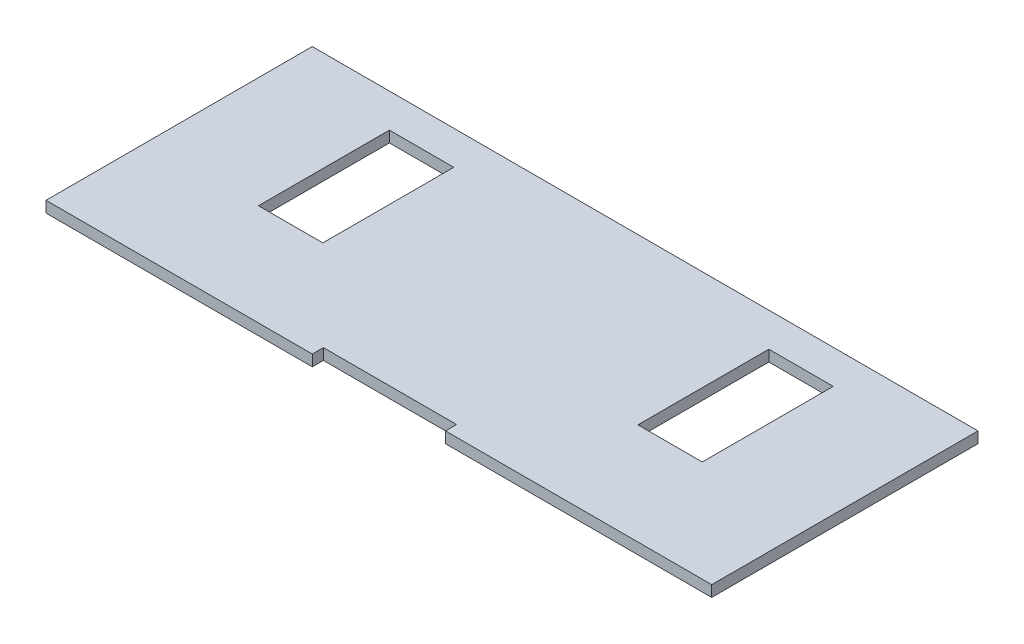
ISO-10303-21;
HEADER;
FILE_DESCRIPTION(('STEP AP214'),'2;1');
FILE_NAME('part.step','',(''),(''),'','','');
FILE_SCHEMA(('AUTOMOTIVE_DESIGN { 1 0 10303 214 1 1 1 1 }'));
ENDSEC;
DATA;
#1=APPLICATION_CONTEXT('core data for automotive mechanical design processes');
#2=APPLICATION_PROTOCOL_DEFINITION('international standard','automotive_design',2000,#1);
#3=PRODUCT_CONTEXT('',#1,'mechanical');
#4=PRODUCT('Part','Part','',(#3));
#5=PRODUCT_RELATED_PRODUCT_CATEGORY('part','',(#4));
#6=PRODUCT_DEFINITION_FORMATION('','',#4);
#7=PRODUCT_DEFINITION_CONTEXT('part definition',#1,'design');
#8=PRODUCT_DEFINITION('design','',#6,#7);
#9=PRODUCT_DEFINITION_SHAPE('','',#8);
#10=(LENGTH_UNIT() NAMED_UNIT(*) SI_UNIT(.MILLI.,.METRE.));
#11=(NAMED_UNIT(*) PLANE_ANGLE_UNIT() SI_UNIT($,.RADIAN.));
#12=(NAMED_UNIT(*) SI_UNIT($,.STERADIAN.) SOLID_ANGLE_UNIT());
#13=UNCERTAINTY_MEASURE_WITH_UNIT(LENGTH_MEASURE(1.E-05),#10,'distance_accuracy_value','');
#14=(GEOMETRIC_REPRESENTATION_CONTEXT(3) GLOBAL_UNCERTAINTY_ASSIGNED_CONTEXT((#13)) GLOBAL_UNIT_ASSIGNED_CONTEXT((#10,
#11,#12)) REPRESENTATION_CONTEXT('',''));
#15=CARTESIAN_POINT('',(0.,0.,0.));
#16=DIRECTION('',(0.,0.,1.));
#17=DIRECTION('',(1.,0.,0.));
#18=AXIS2_PLACEMENT_3D('',#15,#16,#17);
#19=CARTESIAN_POINT('',(-300.,5.,0.));
#20=DIRECTION('',(0.,0.,-1.));
#21=DIRECTION('',(-1.,0.,0.));
#22=AXIS2_PLACEMENT_3D('',#19,#20,#21);
#23=PLANE('',#22);
#24=DIRECTION('',(1.,0.,0.));
#25=VECTOR('',#24,1.);
#26=CARTESIAN_POINT('',(-300.,5.,0.));
#27=LINE('',#26,#25);
#28=CARTESIAN_POINT('',(-120.,5.,0.));
#29=VERTEX_POINT('',#28);
#30=CARTESIAN_POINT('',(0.,5.,0.));
#31=VERTEX_POINT('',#30);
#32=EDGE_CURVE('E286',#29,#31,#27,.T.);
#33=ORIENTED_EDGE('',*,*,#32,.F.);
#34=DIRECTION('',(0.,1.,0.));
#35=VECTOR('',#34,1.);
#36=CARTESIAN_POINT('',(-120.,0.,0.));
#37=LINE('',#36,#35);
#38=CARTESIAN_POINT('',(-120.,0.,0.));
#39=VERTEX_POINT('',#38);
#40=EDGE_CURVE('E226',#39,#29,#37,.T.);
#41=ORIENTED_EDGE('',*,*,#40,.F.);
#42=DIRECTION('',(1.,0.,0.));
#43=VECTOR('',#42,1.);
#44=CARTESIAN_POINT('',(-300.,0.,0.));
#45=LINE('',#44,#43);
#46=CARTESIAN_POINT('',(0.,0.,0.));
#47=VERTEX_POINT('',#46);
#48=EDGE_CURVE('E302',#39,#47,#45,.T.);
#49=ORIENTED_EDGE('',*,*,#48,.T.);
#50=DIRECTION('',(0.,-1.,0.));
#51=VECTOR('',#50,1.);
#52=CARTESIAN_POINT('',(0.,5.,0.));
#53=LINE('',#52,#51);
#54=EDGE_CURVE('E47',#31,#47,#53,.T.);
#55=ORIENTED_EDGE('',*,*,#54,.F.);
#56=EDGE_LOOP('',(#33,#41,#49,#55));
#57=FACE_BOUND('',#56,.T.);
#58=ADVANCED_FACE('F38',(#57),#23,.F.);
#59=CARTESIAN_POINT('',(-300.,5.,-120.));
#60=DIRECTION('',(1.,0.,0.));
#61=DIRECTION('',(0.,0.,-1.));
#62=AXIS2_PLACEMENT_3D('',#59,#60,#61);
#63=PLANE('',#62);
#64=DIRECTION('',(0.,0.,1.));
#65=VECTOR('',#64,1.);
#66=CARTESIAN_POINT('',(-300.,0.,-120.));
#67=LINE('',#66,#65);
#68=CARTESIAN_POINT('',(-300.,0.,-120.));
#69=VERTEX_POINT('',#68);
#70=CARTESIAN_POINT('',(-300.,0.,0.));
#71=VERTEX_POINT('',#70);
#72=EDGE_CURVE('E199',#69,#71,#67,.T.);
#73=ORIENTED_EDGE('',*,*,#72,.T.);
#74=DIRECTION('',(0.,-1.,0.));
#75=VECTOR('',#74,1.);
#76=CARTESIAN_POINT('',(-300.,5.,0.));
#77=LINE('',#76,#75);
#78=CARTESIAN_POINT('',(-300.,5.,0.));
#79=VERTEX_POINT('',#78);
#80=EDGE_CURVE('E11',#79,#71,#77,.T.);
#81=ORIENTED_EDGE('',*,*,#80,.F.);
#82=DIRECTION('',(0.,0.,1.));
#83=VECTOR('',#82,1.);
#84=CARTESIAN_POINT('',(-300.,5.,-120.));
#85=LINE('',#84,#83);
#86=CARTESIAN_POINT('',(-300.,5.,-120.));
#87=VERTEX_POINT('',#86);
#88=EDGE_CURVE('E282',#87,#79,#85,.T.);
#89=ORIENTED_EDGE('',*,*,#88,.F.);
#90=DIRECTION('',(0.,-1.,0.));
#91=VECTOR('',#90,1.);
#92=CARTESIAN_POINT('',(-300.,5.,-120.));
#93=LINE('',#92,#91);
#94=EDGE_CURVE('E298',#87,#69,#93,.T.);
#95=ORIENTED_EDGE('',*,*,#94,.T.);
#96=EDGE_LOOP('',(#73,#81,#89,#95));
#97=FACE_BOUND('',#96,.T.);
#98=ADVANCED_FACE('F40',(#97),#63,.F.);
#99=CARTESIAN_POINT('',(-180.,0.,0.));
#100=VERTEX_POINT('',#99);
#101=EDGE_CURVE('E303',#71,#100,#45,.T.);
#102=ORIENTED_EDGE('',*,*,#101,.T.);
#103=DIRECTION('',(0.,1.,0.));
#104=VECTOR('',#103,1.);
#105=CARTESIAN_POINT('',(-180.,0.,0.));
#106=LINE('',#105,#104);
#107=CARTESIAN_POINT('',(-180.,5.,0.));
#108=VERTEX_POINT('',#107);
#109=EDGE_CURVE('E273',#100,#108,#106,.T.);
#110=ORIENTED_EDGE('',*,*,#109,.T.);
#111=EDGE_CURVE('E288',#79,#108,#27,.T.);
#112=ORIENTED_EDGE('',*,*,#111,.F.);
#113=ORIENTED_EDGE('',*,*,#80,.T.);
#114=EDGE_LOOP('',(#102,#110,#112,#113));
#115=FACE_BOUND('',#114,.T.);
#116=ADVANCED_FACE('F356',(#115),#23,.F.);
#117=CARTESIAN_POINT('',(0.,5.,-120.));
#118=DIRECTION('',(-1.,0.,0.));
#119=DIRECTION('',(0.,0.,1.));
#120=AXIS2_PLACEMENT_3D('',#117,#118,#119);
#121=PLANE('',#120);
#122=DIRECTION('',(0.,0.,-1.));
#123=VECTOR('',#122,1.);
#124=CARTESIAN_POINT('',(0.,0.,-120.));
#125=LINE('',#124,#123);
#126=CARTESIAN_POINT('',(0.,0.,-120.));
#127=VERTEX_POINT('',#126);
#128=EDGE_CURVE('E307',#47,#127,#125,.T.);
#129=ORIENTED_EDGE('',*,*,#128,.T.);
#130=DIRECTION('',(0.,-1.,0.));
#131=VECTOR('',#130,1.);
#132=CARTESIAN_POINT('',(0.,5.,-120.));
#133=LINE('',#132,#131);
#134=CARTESIAN_POINT('',(0.,5.,-120.));
#135=VERTEX_POINT('',#134);
#136=EDGE_CURVE('E315',#135,#127,#133,.T.);
#137=ORIENTED_EDGE('',*,*,#136,.F.);
#138=DIRECTION('',(0.,0.,-1.));
#139=VECTOR('',#138,1.);
#140=CARTESIAN_POINT('',(0.,5.,-120.));
#141=LINE('',#140,#139);
#142=EDGE_CURVE('E292',#31,#135,#141,.T.);
#143=ORIENTED_EDGE('',*,*,#142,.F.);
#144=ORIENTED_EDGE('',*,*,#54,.T.);
#145=EDGE_LOOP('',(#129,#137,#143,#144));
#146=FACE_BOUND('',#145,.T.);
#147=ADVANCED_FACE('F324',(#146),#121,.F.);
#148=CARTESIAN_POINT('',(-300.,5.,-120.));
#149=DIRECTION('',(0.,0.,1.));
#150=DIRECTION('',(1.,0.,0.));
#151=AXIS2_PLACEMENT_3D('',#148,#149,#150);
#152=PLANE('',#151);
#153=DIRECTION('',(-1.,0.,0.));
#154=VECTOR('',#153,1.);
#155=CARTESIAN_POINT('',(-300.,0.,-120.));
#156=LINE('',#155,#154);
#157=EDGE_CURVE('E287',#127,#69,#156,.T.);
#158=ORIENTED_EDGE('',*,*,#157,.T.);
#159=ORIENTED_EDGE('',*,*,#94,.F.);
#160=DIRECTION('',(-1.,0.,0.));
#161=VECTOR('',#160,1.);
#162=CARTESIAN_POINT('',(-300.,5.,-120.));
#163=LINE('',#162,#161);
#164=EDGE_CURVE('E295',#135,#87,#163,.T.);
#165=ORIENTED_EDGE('',*,*,#164,.F.);
#166=ORIENTED_EDGE('',*,*,#136,.T.);
#167=EDGE_LOOP('',(#158,#159,#165,#166));
#168=FACE_BOUND('',#167,.T.);
#169=ADVANCED_FACE('F334',(#168),#152,.F.);
#170=CARTESIAN_POINT('',(0.,5.,0.));
#171=DIRECTION('',(0.,1.,0.));
#172=DIRECTION('',(0.,0.,1.));
#173=AXIS2_PLACEMENT_3D('',#170,#171,#172);
#174=PLANE('',#173);
#175=DIRECTION('',(0.,0.,-1.));
#176=VECTOR('',#175,1.);
#177=CARTESIAN_POINT('',(-50.,5.,-45.75));
#178=LINE('',#177,#176);
#179=CARTESIAN_POINT('',(-50.,5.,-45.75));
#180=VERTEX_POINT('',#179);
#181=CARTESIAN_POINT('',(-50.,5.,-104.75));
#182=VERTEX_POINT('',#181);
#183=EDGE_CURVE('E54',#180,#182,#178,.T.);
#184=ORIENTED_EDGE('',*,*,#183,.F.);
#185=DIRECTION('',(1.,0.,0.));
#186=VECTOR('',#185,1.);
#187=CARTESIAN_POINT('',(-50.,5.,-45.75));
#188=LINE('',#187,#186);
#189=CARTESIAN_POINT('',(-79.,5.,-45.75));
#190=VERTEX_POINT('',#189);
#191=EDGE_CURVE('E176',#190,#180,#188,.T.);
#192=ORIENTED_EDGE('',*,*,#191,.F.);
#193=DIRECTION('',(0.,0.,1.));
#194=VECTOR('',#193,1.);
#195=CARTESIAN_POINT('',(-79.,5.,-45.75));
#196=LINE('',#195,#194);
#197=CARTESIAN_POINT('',(-79.,5.,-104.75));
#198=VERTEX_POINT('',#197);
#199=EDGE_CURVE('E180',#198,#190,#196,.T.);
#200=ORIENTED_EDGE('',*,*,#199,.F.);
#201=DIRECTION('',(-1.,0.,0.));
#202=VECTOR('',#201,1.);
#203=CARTESIAN_POINT('',(-50.,5.,-104.75));
#204=LINE('',#203,#202);
#205=EDGE_CURVE('E189',#182,#198,#204,.T.);
#206=ORIENTED_EDGE('',*,*,#205,.F.);
#207=EDGE_LOOP('',(#184,#192,#200,#206));
#208=FACE_BOUND('',#207,.T.);
#209=DIRECTION('',(0.,0.,-1.));
#210=VECTOR('',#209,1.);
#211=CARTESIAN_POINT('',(-221.,5.,-45.75));
#212=LINE('',#211,#210);
#213=CARTESIAN_POINT('',(-221.,5.,-45.75));
#214=VERTEX_POINT('',#213);
#215=CARTESIAN_POINT('',(-221.,5.,-104.75));
#216=VERTEX_POINT('',#215);
#217=EDGE_CURVE('E62',#214,#216,#212,.T.);
#218=ORIENTED_EDGE('',*,*,#217,.F.);
#219=DIRECTION('',(1.,0.,0.));
#220=VECTOR('',#219,1.);
#221=CARTESIAN_POINT('',(-221.,5.,-45.75));
#222=LINE('',#221,#220);
#223=CARTESIAN_POINT('',(-250.,5.,-45.75));
#224=VERTEX_POINT('',#223);
#225=EDGE_CURVE('E210',#224,#214,#222,.T.);
#226=ORIENTED_EDGE('',*,*,#225,.F.);
#227=DIRECTION('',(0.,0.,1.));
#228=VECTOR('',#227,1.);
#229=CARTESIAN_POINT('',(-250.,5.,-45.75));
#230=LINE('',#229,#228);
#231=CARTESIAN_POINT('',(-250.,5.,-104.75));
#232=VERTEX_POINT('',#231);
#233=EDGE_CURVE('E230',#232,#224,#230,.T.);
#234=ORIENTED_EDGE('',*,*,#233,.F.);
#235=DIRECTION('',(-1.,0.,0.));
#236=VECTOR('',#235,1.);
#237=CARTESIAN_POINT('',(-221.,5.,-104.75));
#238=LINE('',#237,#236);
#239=EDGE_CURVE('E225',#216,#232,#238,.T.);
#240=ORIENTED_EDGE('',*,*,#239,.F.);
#241=EDGE_LOOP('',(#218,#226,#234,#240));
#242=FACE_BOUND('',#241,.T.);
#243=DIRECTION('',(0.,0.,-1.));
#244=VECTOR('',#243,1.);
#245=CARTESIAN_POINT('',(-120.,5.,0.));
#246=LINE('',#245,#244);
#247=CARTESIAN_POINT('',(-120.,5.,-5.));
#248=VERTEX_POINT('',#247);
#249=EDGE_CURVE('E261',#29,#248,#246,.T.);
#250=ORIENTED_EDGE('',*,*,#249,.F.);
#251=ORIENTED_EDGE('',*,*,#32,.T.);
#252=ORIENTED_EDGE('',*,*,#142,.T.);
#253=ORIENTED_EDGE('',*,*,#164,.T.);
#254=ORIENTED_EDGE('',*,*,#88,.T.);
#255=ORIENTED_EDGE('',*,*,#111,.T.);
#256=DIRECTION('',(0.,0.,1.));
#257=VECTOR('',#256,1.);
#258=CARTESIAN_POINT('',(-180.,5.,0.));
#259=LINE('',#258,#257);
#260=CARTESIAN_POINT('',(-180.,5.,-4.99999999999999));
#261=VERTEX_POINT('',#260);
#262=EDGE_CURVE('E252',#261,#108,#259,.T.);
#263=ORIENTED_EDGE('',*,*,#262,.F.);
#264=DIRECTION('',(-1.,0.,0.));
#265=VECTOR('',#264,1.);
#266=CARTESIAN_POINT('',(-120.,5.,-5.));
#267=LINE('',#266,#265);
#268=EDGE_CURVE('E265',#248,#261,#267,.T.);
#269=ORIENTED_EDGE('',*,*,#268,.F.);
#270=EDGE_LOOP('',(#250,#251,#252,#253,#254,#255,#263,#269));
#271=FACE_BOUND('',#270,.T.);
#272=ADVANCED_FACE('F341',(#208,#242,#271),#174,.T.);
#273=CARTESIAN_POINT('',(0.,0.,0.));
#274=DIRECTION('',(0.,1.,0.));
#275=DIRECTION('',(0.,0.,1.));
#276=AXIS2_PLACEMENT_3D('',#273,#274,#275);
#277=PLANE('',#276);
#278=DIRECTION('',(1.,0.,0.));
#279=VECTOR('',#278,1.);
#280=CARTESIAN_POINT('',(-50.,0.,-45.75));
#281=LINE('',#280,#279);
#282=CARTESIAN_POINT('',(-79.,0.,-45.75));
#283=VERTEX_POINT('',#282);
#284=CARTESIAN_POINT('',(-50.,0.,-45.75));
#285=VERTEX_POINT('',#284);
#286=EDGE_CURVE('E161',#283,#285,#281,.T.);
#287=ORIENTED_EDGE('',*,*,#286,.T.);
#288=DIRECTION('',(0.,0.,-1.));
#289=VECTOR('',#288,1.);
#290=CARTESIAN_POINT('',(-50.,0.,-45.75));
#291=LINE('',#290,#289);
#292=CARTESIAN_POINT('',(-50.,0.,-104.75));
#293=VERTEX_POINT('',#292);
#294=EDGE_CURVE('E154',#285,#293,#291,.T.);
#295=ORIENTED_EDGE('',*,*,#294,.T.);
#296=DIRECTION('',(-1.,0.,0.));
#297=VECTOR('',#296,1.);
#298=CARTESIAN_POINT('',(-50.,0.,-104.75));
#299=LINE('',#298,#297);
#300=CARTESIAN_POINT('',(-79.,0.,-104.75));
#301=VERTEX_POINT('',#300);
#302=EDGE_CURVE('E165',#293,#301,#299,.T.);
#303=ORIENTED_EDGE('',*,*,#302,.T.);
#304=DIRECTION('',(0.,0.,1.));
#305=VECTOR('',#304,1.);
#306=CARTESIAN_POINT('',(-79.,0.,-45.75));
#307=LINE('',#306,#305);
#308=EDGE_CURVE('E170',#301,#283,#307,.T.);
#309=ORIENTED_EDGE('',*,*,#308,.T.);
#310=EDGE_LOOP('',(#287,#295,#303,#309));
#311=FACE_BOUND('',#310,.T.);
#312=DIRECTION('',(1.,0.,0.));
#313=VECTOR('',#312,1.);
#314=CARTESIAN_POINT('',(-221.,0.,-45.75));
#315=LINE('',#314,#313);
#316=CARTESIAN_POINT('',(-250.,0.,-45.75));
#317=VERTEX_POINT('',#316);
#318=CARTESIAN_POINT('',(-221.,0.,-45.75));
#319=VERTEX_POINT('',#318);
#320=EDGE_CURVE('E218',#317,#319,#315,.T.);
#321=ORIENTED_EDGE('',*,*,#320,.T.);
#322=DIRECTION('',(0.,0.,-1.));
#323=VECTOR('',#322,1.);
#324=CARTESIAN_POINT('',(-221.,0.,-45.75));
#325=LINE('',#324,#323);
#326=CARTESIAN_POINT('',(-221.,0.,-104.75));
#327=VERTEX_POINT('',#326);
#328=EDGE_CURVE('E205',#319,#327,#325,.T.);
#329=ORIENTED_EDGE('',*,*,#328,.T.);
#330=DIRECTION('',(-1.,0.,0.));
#331=VECTOR('',#330,1.);
#332=CARTESIAN_POINT('',(-221.,0.,-104.75));
#333=LINE('',#332,#331);
#334=CARTESIAN_POINT('',(-250.,0.,-104.75));
#335=VERTEX_POINT('',#334);
#336=EDGE_CURVE('E209',#327,#335,#333,.T.);
#337=ORIENTED_EDGE('',*,*,#336,.T.);
#338=DIRECTION('',(0.,0.,1.));
#339=VECTOR('',#338,1.);
#340=CARTESIAN_POINT('',(-250.,0.,-45.75));
#341=LINE('',#340,#339);
#342=EDGE_CURVE('E214',#335,#317,#341,.T.);
#343=ORIENTED_EDGE('',*,*,#342,.T.);
#344=EDGE_LOOP('',(#321,#329,#337,#343));
#345=FACE_BOUND('',#344,.T.);
#346=ORIENTED_EDGE('',*,*,#48,.F.);
#347=DIRECTION('',(0.,0.,-1.));
#348=VECTOR('',#347,1.);
#349=CARTESIAN_POINT('',(-120.,0.,0.));
#350=LINE('',#349,#348);
#351=CARTESIAN_POINT('',(-120.,0.,-5.));
#352=VERTEX_POINT('',#351);
#353=EDGE_CURVE('E247',#39,#352,#350,.T.);
#354=ORIENTED_EDGE('',*,*,#353,.T.);
#355=DIRECTION('',(-1.,0.,0.));
#356=VECTOR('',#355,1.);
#357=CARTESIAN_POINT('',(-120.,0.,-5.));
#358=LINE('',#357,#356);
#359=CARTESIAN_POINT('',(-180.,0.,-4.99999999999999));
#360=VERTEX_POINT('',#359);
#361=EDGE_CURVE('E251',#352,#360,#358,.T.);
#362=ORIENTED_EDGE('',*,*,#361,.T.);
#363=DIRECTION('',(0.,0.,1.));
#364=VECTOR('',#363,1.);
#365=CARTESIAN_POINT('',(-180.,0.,0.));
#366=LINE('',#365,#364);
#367=EDGE_CURVE('E256',#360,#100,#366,.T.);
#368=ORIENTED_EDGE('',*,*,#367,.T.);
#369=ORIENTED_EDGE('',*,*,#101,.F.);
#370=ORIENTED_EDGE('',*,*,#72,.F.);
#371=ORIENTED_EDGE('',*,*,#157,.F.);
#372=ORIENTED_EDGE('',*,*,#128,.F.);
#373=EDGE_LOOP('',(#346,#354,#362,#368,#369,#370,#371,#372));
#374=FACE_BOUND('',#373,.T.);
#375=ADVANCED_FACE('F172',(#311,#345,#374),#277,.F.);
#376=CARTESIAN_POINT('',(-120.,0.,0.));
#377=DIRECTION('',(1.,0.,0.));
#378=DIRECTION('',(0.,0.,-1.));
#379=AXIS2_PLACEMENT_3D('',#376,#377,#378);
#380=PLANE('',#379);
#381=ORIENTED_EDGE('',*,*,#249,.T.);
#382=DIRECTION('',(0.,1.,0.));
#383=VECTOR('',#382,1.);
#384=CARTESIAN_POINT('',(-120.,0.,-5.));
#385=LINE('',#384,#383);
#386=EDGE_CURVE('E260',#352,#248,#385,.T.);
#387=ORIENTED_EDGE('',*,*,#386,.F.);
#388=ORIENTED_EDGE('',*,*,#353,.F.);
#389=ORIENTED_EDGE('',*,*,#40,.T.);
#390=EDGE_LOOP('',(#381,#387,#388,#389));
#391=FACE_BOUND('',#390,.T.);
#392=ADVANCED_FACE('F348',(#391),#380,.F.);
#393=CARTESIAN_POINT('',(-180.,0.,0.));
#394=DIRECTION('',(-1.,0.,0.));
#395=DIRECTION('',(0.,0.,1.));
#396=AXIS2_PLACEMENT_3D('',#393,#394,#395);
#397=PLANE('',#396);
#398=ORIENTED_EDGE('',*,*,#262,.T.);
#399=ORIENTED_EDGE('',*,*,#109,.F.);
#400=ORIENTED_EDGE('',*,*,#367,.F.);
#401=DIRECTION('',(0.,1.,0.));
#402=VECTOR('',#401,1.);
#403=CARTESIAN_POINT('',(-180.,0.,-4.99999999999999));
#404=LINE('',#403,#402);
#405=EDGE_CURVE('E277',#360,#261,#404,.T.);
#406=ORIENTED_EDGE('',*,*,#405,.T.);
#407=EDGE_LOOP('',(#398,#399,#400,#406));
#408=FACE_BOUND('',#407,.T.);
#409=ADVANCED_FACE('F354',(#408),#397,.F.);
#410=CARTESIAN_POINT('',(-120.,0.,-5.));
#411=DIRECTION('',(0.,0.,-1.));
#412=DIRECTION('',(-1.,0.,0.));
#413=AXIS2_PLACEMENT_3D('',#410,#411,#412);
#414=PLANE('',#413);
#415=ORIENTED_EDGE('',*,*,#268,.T.);
#416=ORIENTED_EDGE('',*,*,#405,.F.);
#417=ORIENTED_EDGE('',*,*,#361,.F.);
#418=ORIENTED_EDGE('',*,*,#386,.T.);
#419=EDGE_LOOP('',(#415,#416,#417,#418));
#420=FACE_BOUND('',#419,.T.);
#421=ADVANCED_FACE('F352',(#420),#414,.F.);
#422=CARTESIAN_POINT('',(-221.,0.,-45.75));
#423=DIRECTION('',(1.,0.,0.));
#424=DIRECTION('',(0.,0.,-1.));
#425=AXIS2_PLACEMENT_3D('',#422,#423,#424);
#426=PLANE('',#425);
#427=ORIENTED_EDGE('',*,*,#217,.T.);
#428=DIRECTION('',(0.,1.,0.));
#429=VECTOR('',#428,1.);
#430=CARTESIAN_POINT('',(-221.,0.,-104.75));
#431=LINE('',#430,#429);
#432=EDGE_CURVE('E222',#327,#216,#431,.T.);
#433=ORIENTED_EDGE('',*,*,#432,.F.);
#434=ORIENTED_EDGE('',*,*,#328,.F.);
#435=DIRECTION('',(0.,1.,0.));
#436=VECTOR('',#435,1.);
#437=CARTESIAN_POINT('',(-221.,0.,-45.75));
#438=LINE('',#437,#436);
#439=EDGE_CURVE('E190',#319,#214,#438,.T.);
#440=ORIENTED_EDGE('',*,*,#439,.T.);
#441=EDGE_LOOP('',(#427,#433,#434,#440));
#442=FACE_BOUND('',#441,.T.);
#443=ADVANCED_FACE('F427',(#442),#426,.F.);
#444=CARTESIAN_POINT('',(-221.,0.,-45.75));
#445=DIRECTION('',(0.,0.,1.));
#446=DIRECTION('',(1.,0.,0.));
#447=AXIS2_PLACEMENT_3D('',#444,#445,#446);
#448=PLANE('',#447);
#449=ORIENTED_EDGE('',*,*,#225,.T.);
#450=ORIENTED_EDGE('',*,*,#439,.F.);
#451=ORIENTED_EDGE('',*,*,#320,.F.);
#452=DIRECTION('',(0.,1.,0.));
#453=VECTOR('',#452,1.);
#454=CARTESIAN_POINT('',(-250.,0.,-45.75));
#455=LINE('',#454,#453);
#456=EDGE_CURVE('E239',#317,#224,#455,.T.);
#457=ORIENTED_EDGE('',*,*,#456,.T.);
#458=EDGE_LOOP('',(#449,#450,#451,#457));
#459=FACE_BOUND('',#458,.T.);
#460=ADVANCED_FACE('F434',(#459),#448,.F.);
#461=CARTESIAN_POINT('',(-250.,0.,-45.75));
#462=DIRECTION('',(-1.,0.,0.));
#463=DIRECTION('',(0.,0.,1.));
#464=AXIS2_PLACEMENT_3D('',#461,#462,#463);
#465=PLANE('',#464);
#466=ORIENTED_EDGE('',*,*,#233,.T.);
#467=ORIENTED_EDGE('',*,*,#456,.F.);
#468=ORIENTED_EDGE('',*,*,#342,.F.);
#469=DIRECTION('',(0.,1.,0.));
#470=VECTOR('',#469,1.);
#471=CARTESIAN_POINT('',(-250.,0.,-104.75));
#472=LINE('',#471,#470);
#473=EDGE_CURVE('E242',#335,#232,#472,.T.);
#474=ORIENTED_EDGE('',*,*,#473,.T.);
#475=EDGE_LOOP('',(#466,#467,#468,#474));
#476=FACE_BOUND('',#475,.T.);
#477=ADVANCED_FACE('F441',(#476),#465,.F.);
#478=CARTESIAN_POINT('',(-221.,0.,-104.75));
#479=DIRECTION('',(0.,0.,-1.));
#480=DIRECTION('',(-1.,0.,0.));
#481=AXIS2_PLACEMENT_3D('',#478,#479,#480);
#482=PLANE('',#481);
#483=ORIENTED_EDGE('',*,*,#239,.T.);
#484=ORIENTED_EDGE('',*,*,#473,.F.);
#485=ORIENTED_EDGE('',*,*,#336,.F.);
#486=ORIENTED_EDGE('',*,*,#432,.T.);
#487=EDGE_LOOP('',(#483,#484,#485,#486));
#488=FACE_BOUND('',#487,.T.);
#489=ADVANCED_FACE('F449',(#488),#482,.F.);
#490=CARTESIAN_POINT('',(-50.,0.,-45.75));
#491=DIRECTION('',(1.,0.,0.));
#492=DIRECTION('',(0.,0.,-1.));
#493=AXIS2_PLACEMENT_3D('',#490,#491,#492);
#494=PLANE('',#493);
#495=ORIENTED_EDGE('',*,*,#183,.T.);
#496=DIRECTION('',(0.,1.,0.));
#497=VECTOR('',#496,1.);
#498=CARTESIAN_POINT('',(-50.,0.,-104.75));
#499=LINE('',#498,#497);
#500=EDGE_CURVE('E150',#293,#182,#499,.T.);
#501=ORIENTED_EDGE('',*,*,#500,.F.);
#502=ORIENTED_EDGE('',*,*,#294,.F.);
#503=DIRECTION('',(0.,1.,0.));
#504=VECTOR('',#503,1.);
#505=CARTESIAN_POINT('',(-50.,0.,-45.75));
#506=LINE('',#505,#504);
#507=EDGE_CURVE('E196',#285,#180,#506,.T.);
#508=ORIENTED_EDGE('',*,*,#507,.T.);
#509=EDGE_LOOP('',(#495,#501,#502,#508));
#510=FACE_BOUND('',#509,.T.);
#511=ADVANCED_FACE('F152',(#510),#494,.F.);
#512=CARTESIAN_POINT('',(-50.,0.,-45.75));
#513=DIRECTION('',(0.,0.,1.));
#514=DIRECTION('',(1.,0.,0.));
#515=AXIS2_PLACEMENT_3D('',#512,#513,#514);
#516=PLANE('',#515);
#517=ORIENTED_EDGE('',*,*,#191,.T.);
#518=ORIENTED_EDGE('',*,*,#507,.F.);
#519=ORIENTED_EDGE('',*,*,#286,.F.);
#520=DIRECTION('',(0.,1.,0.));
#521=VECTOR('',#520,1.);
#522=CARTESIAN_POINT('',(-79.,0.,-45.75));
#523=LINE('',#522,#521);
#524=EDGE_CURVE('E200',#283,#190,#523,.T.);
#525=ORIENTED_EDGE('',*,*,#524,.T.);
#526=EDGE_LOOP('',(#517,#518,#519,#525));
#527=FACE_BOUND('',#526,.T.);
#528=ADVANCED_FACE('F464',(#527),#516,.F.);
#529=CARTESIAN_POINT('',(-79.,0.,-45.75));
#530=DIRECTION('',(-1.,0.,0.));
#531=DIRECTION('',(0.,0.,1.));
#532=AXIS2_PLACEMENT_3D('',#529,#530,#531);
#533=PLANE('',#532);
#534=ORIENTED_EDGE('',*,*,#199,.T.);
#535=ORIENTED_EDGE('',*,*,#524,.F.);
#536=ORIENTED_EDGE('',*,*,#308,.F.);
#537=DIRECTION('',(0.,1.,0.));
#538=VECTOR('',#537,1.);
#539=CARTESIAN_POINT('',(-79.,0.,-104.75));
#540=LINE('',#539,#538);
#541=EDGE_CURVE('E160',#301,#198,#540,.T.);
#542=ORIENTED_EDGE('',*,*,#541,.T.);
#543=EDGE_LOOP('',(#534,#535,#536,#542));
#544=FACE_BOUND('',#543,.T.);
#545=ADVANCED_FACE('F471',(#544),#533,.F.);
#546=CARTESIAN_POINT('',(-50.,0.,-104.75));
#547=DIRECTION('',(0.,0.,-1.));
#548=DIRECTION('',(-1.,0.,0.));
#549=AXIS2_PLACEMENT_3D('',#546,#547,#548);
#550=PLANE('',#549);
#551=ORIENTED_EDGE('',*,*,#205,.T.);
#552=ORIENTED_EDGE('',*,*,#541,.F.);
#553=ORIENTED_EDGE('',*,*,#302,.F.);
#554=ORIENTED_EDGE('',*,*,#500,.T.);
#555=EDGE_LOOP('',(#551,#552,#553,#554));
#556=FACE_BOUND('',#555,.T.);
#557=ADVANCED_FACE('F166',(#556),#550,.F.);
#558=CLOSED_SHELL('',(#58,#98,#116,#147,#169,#272,#375,#392,#409,#421,#443,#460,#477,#489,#511,
#528,#545,#557));
#559=MANIFOLD_SOLID_BREP('B2',#558);
#560=ADVANCED_BREP_SHAPE_REPRESENTATION('',(#18,#559),#14);
#561=SHAPE_DEFINITION_REPRESENTATION(#9,#560);
ENDSEC;
END-ISO-10303-21;
